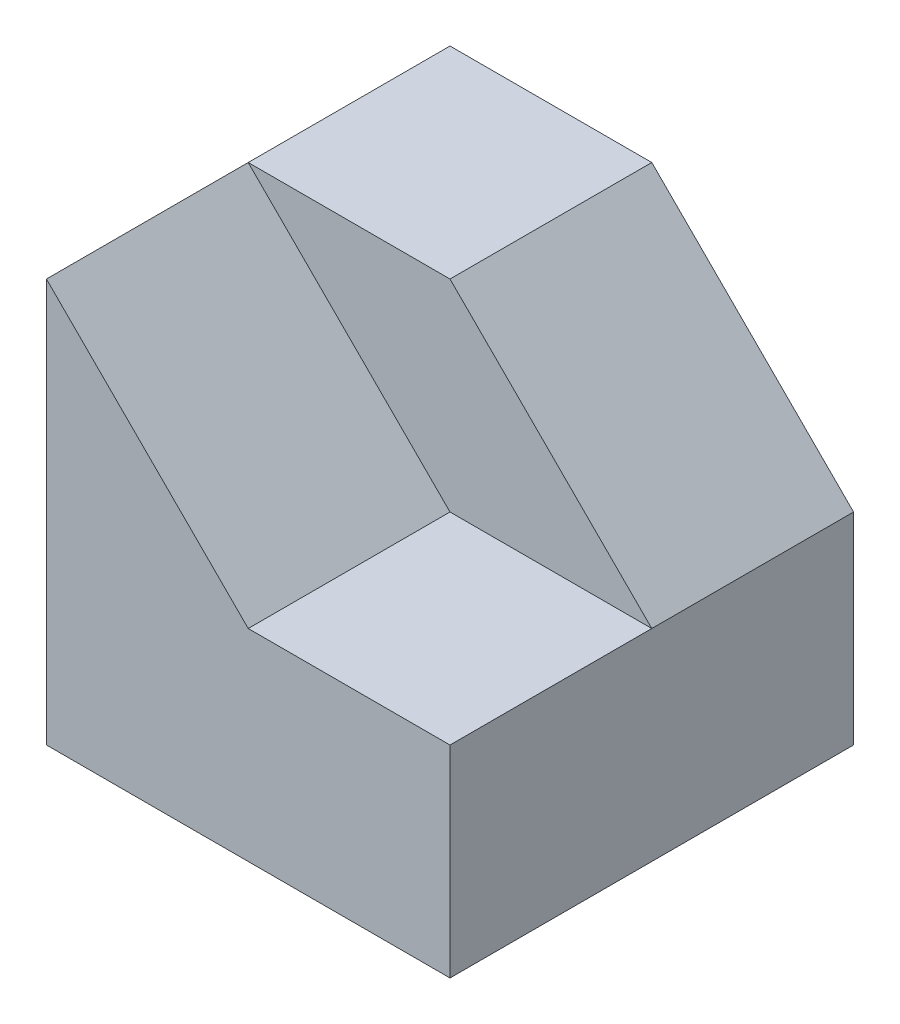
ISO-10303-21;
HEADER;
FILE_DESCRIPTION(('STEP AP214'),'2;1');
FILE_NAME('part.step','',(''),(''),'','','');
FILE_SCHEMA(('AUTOMOTIVE_DESIGN { 1 0 10303 214 1 1 1 1 }'));
ENDSEC;
DATA;
#1=APPLICATION_CONTEXT('core data for automotive mechanical design processes');
#2=APPLICATION_PROTOCOL_DEFINITION('international standard','automotive_design',2000,#1);
#3=PRODUCT_CONTEXT('',#1,'mechanical');
#4=PRODUCT('Part','Part','',(#3));
#5=PRODUCT_RELATED_PRODUCT_CATEGORY('part','',(#4));
#6=PRODUCT_DEFINITION_FORMATION('','',#4);
#7=PRODUCT_DEFINITION_CONTEXT('part definition',#1,'design');
#8=PRODUCT_DEFINITION('design','',#6,#7);
#9=PRODUCT_DEFINITION_SHAPE('','',#8);
#10=(LENGTH_UNIT() NAMED_UNIT(*) SI_UNIT(.MILLI.,.METRE.));
#11=(NAMED_UNIT(*) PLANE_ANGLE_UNIT() SI_UNIT($,.RADIAN.));
#12=(NAMED_UNIT(*) SI_UNIT($,.STERADIAN.) SOLID_ANGLE_UNIT());
#13=UNCERTAINTY_MEASURE_WITH_UNIT(LENGTH_MEASURE(1.E-05),#10,'distance_accuracy_value','');
#14=(GEOMETRIC_REPRESENTATION_CONTEXT(3) GLOBAL_UNCERTAINTY_ASSIGNED_CONTEXT((#13)) GLOBAL_UNIT_ASSIGNED_CONTEXT((#10,
#11,#12)) REPRESENTATION_CONTEXT('',''));
#15=CARTESIAN_POINT('',(0.,0.,0.));
#16=DIRECTION('',(0.,0.,1.));
#17=DIRECTION('',(1.,0.,0.));
#18=AXIS2_PLACEMENT_3D('',#15,#16,#17);
#19=CARTESIAN_POINT('',(0.,60.,-60.));
#20=DIRECTION('',(-1.,0.,0.));
#21=DIRECTION('',(0.,0.,1.));
#22=AXIS2_PLACEMENT_3D('',#19,#20,#21);
#23=PLANE('',#22);
#24=DIRECTION('',(0.,-1.,0.));
#25=VECTOR('',#24,1.);
#26=CARTESIAN_POINT('',(0.,60.,0.));
#27=LINE('',#26,#25);
#28=CARTESIAN_POINT('',(0.,60.,0.));
#29=VERTEX_POINT('',#28);
#30=CARTESIAN_POINT('',(0.,0.,0.));
#31=VERTEX_POINT('',#30);
#32=EDGE_CURVE('E123',#29,#31,#27,.T.);
#33=ORIENTED_EDGE('',*,*,#32,.F.);
#34=DIRECTION('',(0.,0.,1.));
#35=VECTOR('',#34,1.);
#36=CARTESIAN_POINT('',(0.,60.,-30.));
#37=LINE('',#36,#35);
#38=CARTESIAN_POINT('',(0.,60.,-30.));
#39=VERTEX_POINT('',#38);
#40=EDGE_CURVE('E148',#39,#29,#37,.T.);
#41=ORIENTED_EDGE('',*,*,#40,.F.);
#42=DIRECTION('',(0.,0.,1.));
#43=VECTOR('',#42,1.);
#44=CARTESIAN_POINT('',(0.,60.,-60.));
#45=LINE('',#44,#43);
#46=CARTESIAN_POINT('',(0.,60.,-60.));
#47=VERTEX_POINT('',#46);
#48=EDGE_CURVE('E11',#47,#39,#45,.T.);
#49=ORIENTED_EDGE('',*,*,#48,.F.);
#50=DIRECTION('',(0.,-1.,0.));
#51=VECTOR('',#50,1.);
#52=CARTESIAN_POINT('',(0.,60.,-60.));
#53=LINE('',#52,#51);
#54=CARTESIAN_POINT('',(0.,0.,-60.));
#55=VERTEX_POINT('',#54);
#56=EDGE_CURVE('E116',#47,#55,#53,.T.);
#57=ORIENTED_EDGE('',*,*,#56,.T.);
#58=DIRECTION('',(0.,0.,1.));
#59=VECTOR('',#58,1.);
#60=CARTESIAN_POINT('',(0.,0.,-60.));
#61=LINE('',#60,#59);
#62=EDGE_CURVE('E40',#55,#31,#61,.T.);
#63=ORIENTED_EDGE('',*,*,#62,.T.);
#64=EDGE_LOOP('',(#33,#41,#49,#57,#63));
#65=FACE_BOUND('',#64,.T.);
#66=ADVANCED_FACE('F37',(#65),#23,.T.);
#67=CARTESIAN_POINT('',(60.,60.,-60.));
#68=DIRECTION('',(0.,1.,0.));
#69=DIRECTION('',(0.,0.,1.));
#70=AXIS2_PLACEMENT_3D('',#67,#68,#69);
#71=PLANE('',#70);
#72=DIRECTION('',(0.,0.,1.));
#73=VECTOR('',#72,1.);
#74=CARTESIAN_POINT('',(30.,60.,-60.));
#75=LINE('',#74,#73);
#76=CARTESIAN_POINT('',(30.,60.,-60.));
#77=VERTEX_POINT('',#76);
#78=CARTESIAN_POINT('',(30.,60.,-30.));
#79=VERTEX_POINT('',#78);
#80=EDGE_CURVE('E53',#77,#79,#75,.T.);
#81=ORIENTED_EDGE('',*,*,#80,.F.);
#82=DIRECTION('',(-1.,0.,0.));
#83=VECTOR('',#82,1.);
#84=CARTESIAN_POINT('',(60.,60.,-60.));
#85=LINE('',#84,#83);
#86=EDGE_CURVE('E108',#77,#47,#85,.T.);
#87=ORIENTED_EDGE('',*,*,#86,.T.);
#88=ORIENTED_EDGE('',*,*,#48,.T.);
#89=DIRECTION('',(-1.,0.,0.));
#90=VECTOR('',#89,1.);
#91=CARTESIAN_POINT('',(60.,60.,-30.));
#92=LINE('',#91,#90);
#93=EDGE_CURVE('E110',#79,#39,#92,.T.);
#94=ORIENTED_EDGE('',*,*,#93,.F.);
#95=EDGE_LOOP('',(#81,#87,#88,#94));
#96=FACE_BOUND('',#95,.T.);
#97=ADVANCED_FACE('F107',(#96),#71,.T.);
#98=CARTESIAN_POINT('',(60.,0.,-60.));
#99=DIRECTION('',(1.,0.,0.));
#100=DIRECTION('',(0.,0.,-1.));
#101=AXIS2_PLACEMENT_3D('',#98,#99,#100);
#102=PLANE('',#101);
#103=DIRECTION('',(0.,0.,1.));
#104=VECTOR('',#103,1.);
#105=CARTESIAN_POINT('',(60.,30.,-60.));
#106=LINE('',#105,#104);
#107=CARTESIAN_POINT('',(60.,30.,-60.));
#108=VERTEX_POINT('',#107);
#109=CARTESIAN_POINT('',(60.,30.,-30.));
#110=VERTEX_POINT('',#109);
#111=EDGE_CURVE('E98',#108,#110,#106,.T.);
#112=ORIENTED_EDGE('',*,*,#111,.T.);
#113=DIRECTION('',(0.,0.,-1.));
#114=VECTOR('',#113,1.);
#115=CARTESIAN_POINT('',(60.,30.,0.));
#116=LINE('',#115,#114);
#117=CARTESIAN_POINT('',(60.,30.,0.));
#118=VERTEX_POINT('',#117);
#119=EDGE_CURVE('E141',#118,#110,#116,.T.);
#120=ORIENTED_EDGE('',*,*,#119,.F.);
#121=DIRECTION('',(0.,1.,0.));
#122=VECTOR('',#121,1.);
#123=CARTESIAN_POINT('',(60.,0.,0.));
#124=LINE('',#123,#122);
#125=CARTESIAN_POINT('',(60.,0.,0.));
#126=VERTEX_POINT('',#125);
#127=EDGE_CURVE('E130',#126,#118,#124,.T.);
#128=ORIENTED_EDGE('',*,*,#127,.F.);
#129=DIRECTION('',(0.,0.,1.));
#130=VECTOR('',#129,1.);
#131=CARTESIAN_POINT('',(60.,0.,-60.));
#132=LINE('',#131,#130);
#133=CARTESIAN_POINT('',(60.,0.,-60.));
#134=VERTEX_POINT('',#133);
#135=EDGE_CURVE('E45',#134,#126,#132,.T.);
#136=ORIENTED_EDGE('',*,*,#135,.F.);
#137=DIRECTION('',(0.,1.,0.));
#138=VECTOR('',#137,1.);
#139=CARTESIAN_POINT('',(60.,0.,-60.));
#140=LINE('',#139,#138);
#141=EDGE_CURVE('E117',#134,#108,#140,.T.);
#142=ORIENTED_EDGE('',*,*,#141,.T.);
#143=EDGE_LOOP('',(#112,#120,#128,#136,#142));
#144=FACE_BOUND('',#143,.T.);
#145=ADVANCED_FACE('F139',(#144),#102,.T.);
#146=CARTESIAN_POINT('',(0.,0.,-60.));
#147=DIRECTION('',(0.,-1.,0.));
#148=DIRECTION('',(0.,0.,-1.));
#149=AXIS2_PLACEMENT_3D('',#146,#147,#148);
#150=PLANE('',#149);
#151=DIRECTION('',(1.,0.,0.));
#152=VECTOR('',#151,1.);
#153=CARTESIAN_POINT('',(0.,0.,0.));
#154=LINE('',#153,#152);
#155=EDGE_CURVE('E126',#31,#126,#154,.T.);
#156=ORIENTED_EDGE('',*,*,#155,.F.);
#157=ORIENTED_EDGE('',*,*,#62,.F.);
#158=DIRECTION('',(1.,0.,0.));
#159=VECTOR('',#158,1.);
#160=CARTESIAN_POINT('',(0.,0.,-60.));
#161=LINE('',#160,#159);
#162=EDGE_CURVE('E119',#55,#134,#161,.T.);
#163=ORIENTED_EDGE('',*,*,#162,.T.);
#164=ORIENTED_EDGE('',*,*,#135,.T.);
#165=EDGE_LOOP('',(#156,#157,#163,#164));
#166=FACE_BOUND('',#165,.T.);
#167=ADVANCED_FACE('F136',(#166),#150,.T.);
#168=CARTESIAN_POINT('',(0.,0.,-60.));
#169=DIRECTION('',(0.,0.,1.));
#170=DIRECTION('',(1.,0.,0.));
#171=AXIS2_PLACEMENT_3D('',#168,#169,#170);
#172=PLANE('',#171);
#173=ORIENTED_EDGE('',*,*,#86,.F.);
#174=DIRECTION('',(0.707106781186548,-0.707106781186547,0.));
#175=VECTOR('',#174,1.);
#176=CARTESIAN_POINT('',(30.,60.,-60.));
#177=LINE('',#176,#175);
#178=EDGE_CURVE('E95',#77,#108,#177,.T.);
#179=ORIENTED_EDGE('',*,*,#178,.T.);
#180=ORIENTED_EDGE('',*,*,#141,.F.);
#181=ORIENTED_EDGE('',*,*,#162,.F.);
#182=ORIENTED_EDGE('',*,*,#56,.F.);
#183=EDGE_LOOP('',(#173,#179,#180,#181,#182));
#184=FACE_BOUND('',#183,.T.);
#185=ADVANCED_FACE('F113',(#184),#172,.F.);
#186=CARTESIAN_POINT('',(0.,0.,0.));
#187=DIRECTION('',(0.,0.,1.));
#188=DIRECTION('',(1.,0.,0.));
#189=AXIS2_PLACEMENT_3D('',#186,#187,#188);
#190=PLANE('',#189);
#191=DIRECTION('',(0.707106781186547,-0.707106781186547,0.));
#192=VECTOR('',#191,1.);
#193=CARTESIAN_POINT('',(0.,60.,0.));
#194=LINE('',#193,#192);
#195=CARTESIAN_POINT('',(30.,30.,0.));
#196=VERTEX_POINT('',#195);
#197=EDGE_CURVE('E61',#29,#196,#194,.T.);
#198=ORIENTED_EDGE('',*,*,#197,.F.);
#199=ORIENTED_EDGE('',*,*,#32,.T.);
#200=ORIENTED_EDGE('',*,*,#155,.T.);
#201=ORIENTED_EDGE('',*,*,#127,.T.);
#202=DIRECTION('',(1.,0.,0.));
#203=VECTOR('',#202,1.);
#204=CARTESIAN_POINT('',(30.,30.,0.));
#205=LINE('',#204,#203);
#206=EDGE_CURVE('E156',#196,#118,#205,.T.);
#207=ORIENTED_EDGE('',*,*,#206,.F.);
#208=EDGE_LOOP('',(#198,#199,#200,#201,#207));
#209=FACE_BOUND('',#208,.T.);
#210=ADVANCED_FACE('F144',(#209),#190,.T.);
#211=CARTESIAN_POINT('',(60.,30.,-30.));
#212=DIRECTION('',(0.,0.,-1.));
#213=DIRECTION('',(-1.,0.,0.));
#214=AXIS2_PLACEMENT_3D('',#211,#212,#213);
#215=PLANE('',#214);
#216=DIRECTION('',(-1.,0.,0.));
#217=VECTOR('',#216,1.);
#218=CARTESIAN_POINT('',(60.,30.,-30.));
#219=LINE('',#218,#217);
#220=CARTESIAN_POINT('',(30.,30.,-30.));
#221=VERTEX_POINT('',#220);
#222=EDGE_CURVE('E127',#110,#221,#219,.T.);
#223=ORIENTED_EDGE('',*,*,#222,.F.);
#224=DIRECTION('',(0.707106781186548,-0.707106781186547,0.));
#225=VECTOR('',#224,1.);
#226=CARTESIAN_POINT('',(30.,60.,-30.));
#227=LINE('',#226,#225);
#228=EDGE_CURVE('E103',#79,#110,#227,.T.);
#229=ORIENTED_EDGE('',*,*,#228,.F.);
#230=ORIENTED_EDGE('',*,*,#93,.T.);
#231=DIRECTION('',(0.707106781186547,-0.707106781186547,0.));
#232=VECTOR('',#231,1.);
#233=CARTESIAN_POINT('',(0.,60.,-30.));
#234=LINE('',#233,#232);
#235=EDGE_CURVE('E160',#39,#221,#234,.T.);
#236=ORIENTED_EDGE('',*,*,#235,.T.);
#237=EDGE_LOOP('',(#223,#229,#230,#236));
#238=FACE_BOUND('',#237,.T.);
#239=ADVANCED_FACE('F169',(#238),#215,.F.);
#240=CARTESIAN_POINT('',(0.,30.,0.));
#241=DIRECTION('',(0.,1.,0.));
#242=DIRECTION('',(0.,0.,1.));
#243=AXIS2_PLACEMENT_3D('',#240,#241,#242);
#244=PLANE('',#243);
#245=DIRECTION('',(0.,0.,1.));
#246=VECTOR('',#245,1.);
#247=CARTESIAN_POINT('',(30.,30.,-30.));
#248=LINE('',#247,#246);
#249=EDGE_CURVE('E152',#221,#196,#248,.T.);
#250=ORIENTED_EDGE('',*,*,#249,.T.);
#251=ORIENTED_EDGE('',*,*,#206,.T.);
#252=ORIENTED_EDGE('',*,*,#119,.T.);
#253=ORIENTED_EDGE('',*,*,#222,.T.);
#254=EDGE_LOOP('',(#250,#251,#252,#253));
#255=FACE_BOUND('',#254,.T.);
#256=ADVANCED_FACE('F168',(#255),#244,.T.);
#257=CARTESIAN_POINT('',(0.,60.,-30.));
#258=DIRECTION('',(-0.707106781186547,-0.707106781186547,0.));
#259=DIRECTION('',(0.707106781186548,-0.707106781186548,0.));
#260=AXIS2_PLACEMENT_3D('',#257,#258,#259);
#261=PLANE('',#260);
#262=ORIENTED_EDGE('',*,*,#197,.T.);
#263=ORIENTED_EDGE('',*,*,#249,.F.);
#264=ORIENTED_EDGE('',*,*,#235,.F.);
#265=ORIENTED_EDGE('',*,*,#40,.T.);
#266=EDGE_LOOP('',(#262,#263,#264,#265));
#267=FACE_BOUND('',#266,.T.);
#268=ADVANCED_FACE('F171',(#267),#261,.F.);
#269=CARTESIAN_POINT('',(30.,60.,-60.));
#270=DIRECTION('',(-0.707106781186547,-0.707106781186548,0.));
#271=DIRECTION('',(0.707106781186548,-0.707106781186547,0.));
#272=AXIS2_PLACEMENT_3D('',#269,#270,#271);
#273=PLANE('',#272);
#274=ORIENTED_EDGE('',*,*,#228,.T.);
#275=ORIENTED_EDGE('',*,*,#111,.F.);
#276=ORIENTED_EDGE('',*,*,#178,.F.);
#277=ORIENTED_EDGE('',*,*,#80,.T.);
#278=EDGE_LOOP('',(#274,#275,#276,#277));
#279=FACE_BOUND('',#278,.T.);
#280=ADVANCED_FACE('F96',(#279),#273,.F.);
#281=CLOSED_SHELL('',(#66,#97,#145,#167,#185,#210,#239,#256,#268,#280));
#282=MANIFOLD_SOLID_BREP('B2',#281);
#283=ADVANCED_BREP_SHAPE_REPRESENTATION('',(#18,#282),#14);
#284=SHAPE_DEFINITION_REPRESENTATION(#9,#283);
ENDSEC;
END-ISO-10303-21;
